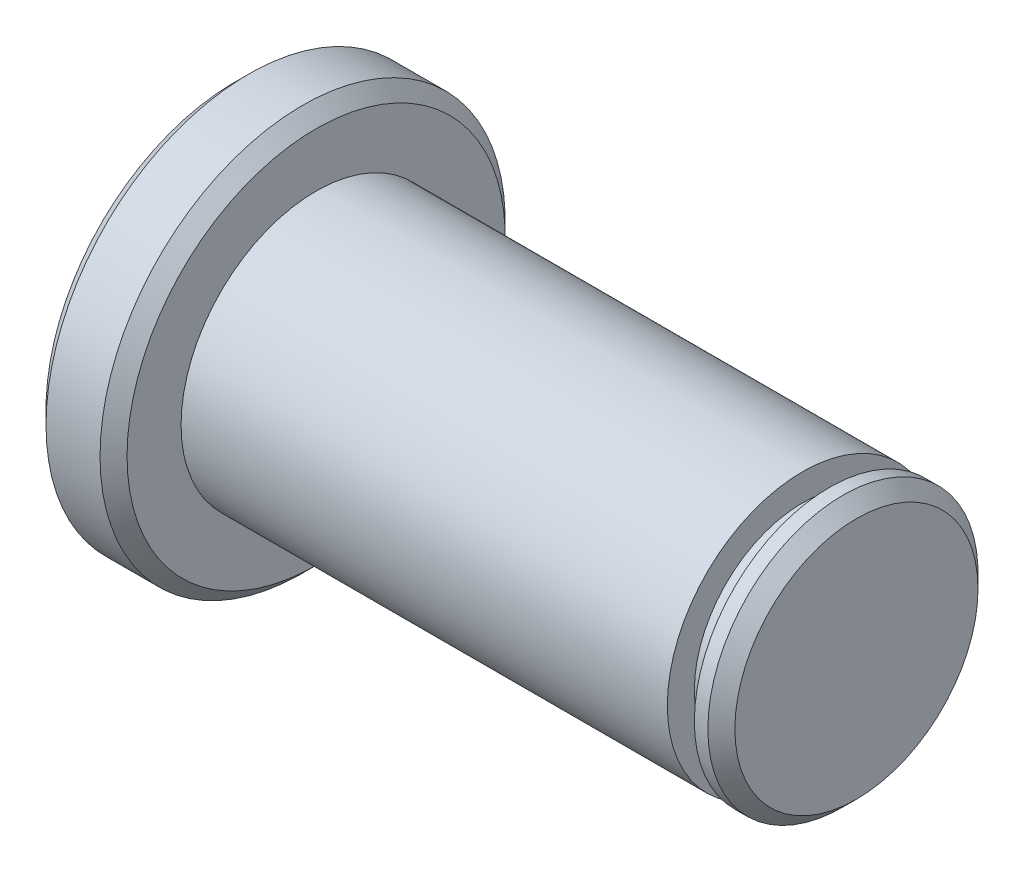
ISO-10303-21;
HEADER;
FILE_DESCRIPTION(('STEP AP214'),'2;1');
FILE_NAME('part.step','',(''),(''),'','','');
FILE_SCHEMA(('AUTOMOTIVE_DESIGN { 1 0 10303 214 1 1 1 1 }'));
ENDSEC;
DATA;
#1=APPLICATION_CONTEXT('core data for automotive mechanical design processes');
#2=APPLICATION_PROTOCOL_DEFINITION('international standard','automotive_design',2000,#1);
#3=PRODUCT_CONTEXT('',#1,'mechanical');
#4=PRODUCT('Part','Part','',(#3));
#5=PRODUCT_RELATED_PRODUCT_CATEGORY('part','',(#4));
#6=PRODUCT_DEFINITION_FORMATION('','',#4);
#7=PRODUCT_DEFINITION_CONTEXT('part definition',#1,'design');
#8=PRODUCT_DEFINITION('design','',#6,#7);
#9=PRODUCT_DEFINITION_SHAPE('','',#8);
#10=(LENGTH_UNIT() NAMED_UNIT(*) SI_UNIT(.MILLI.,.METRE.));
#11=(NAMED_UNIT(*) PLANE_ANGLE_UNIT() SI_UNIT($,.RADIAN.));
#12=(NAMED_UNIT(*) SI_UNIT($,.STERADIAN.) SOLID_ANGLE_UNIT());
#13=UNCERTAINTY_MEASURE_WITH_UNIT(LENGTH_MEASURE(1.E-05),#10,'distance_accuracy_value','');
#14=(GEOMETRIC_REPRESENTATION_CONTEXT(3) GLOBAL_UNCERTAINTY_ASSIGNED_CONTEXT((#13)) GLOBAL_UNIT_ASSIGNED_CONTEXT((#10,
#11,#12)) REPRESENTATION_CONTEXT('',''));
#15=CARTESIAN_POINT('',(0.,0.,0.));
#16=DIRECTION('',(0.,0.,1.));
#17=DIRECTION('',(1.,0.,0.));
#18=AXIS2_PLACEMENT_3D('',#15,#16,#17);
#19=CARTESIAN_POINT('',(-6.23188405797101,0.,0.));
#20=DIRECTION('',(1.,0.,0.));
#21=DIRECTION('',(0.,0.,-1.));
#22=AXIS2_PLACEMENT_3D('',#19,#20,#21);
#23=PLANE('',#22);
#24=CARTESIAN_POINT('',(-6.23188405797101,0.,0.));
#25=DIRECTION('',(1.,0.,0.));
#26=DIRECTION('',(0.,0.,-1.));
#27=AXIS2_PLACEMENT_3D('',#24,#25,#26);
#28=CIRCLE('',#27,7.);
#29=CARTESIAN_POINT('',(-6.23188405797101,0.,-7.));
#30=VERTEX_POINT('',#29);
#31=EDGE_CURVE('E10',#30,#30,#28,.F.);
#32=ORIENTED_EDGE('',*,*,#31,.T.);
#33=EDGE_LOOP('',(#32));
#34=FACE_BOUND('',#33,.T.);
#35=ADVANCED_FACE('F39',(#34),#23,.F.);
#36=CARTESIAN_POINT('',(-11.6304347826087,0.,0.));
#37=DIRECTION('',(-1.,0.,0.));
#38=DIRECTION('',(0.,0.,1.));
#39=AXIS2_PLACEMENT_3D('',#36,#37,#38);
#40=CYLINDRICAL_SURFACE('',#39,7.5);
#41=CARTESIAN_POINT('',(-3.73188405797101,0.,0.));
#42=DIRECTION('',(-1.,0.,0.));
#43=DIRECTION('',(0.,0.,1.));
#44=AXIS2_PLACEMENT_3D('',#41,#42,#43);
#45=CIRCLE('',#44,7.5);
#46=CARTESIAN_POINT('',(-3.73188405797101,0.,7.5));
#47=VERTEX_POINT('',#46);
#48=EDGE_CURVE('E53',#47,#47,#45,.T.);
#49=ORIENTED_EDGE('',*,*,#48,.T.);
#50=EDGE_LOOP('',(#49));
#51=FACE_BOUND('',#50,.T.);
#52=CARTESIAN_POINT('',(-5.73188405797101,0.,0.));
#53=DIRECTION('',(1.,0.,0.));
#54=DIRECTION('',(0.,0.,-1.));
#55=AXIS2_PLACEMENT_3D('',#52,#53,#54);
#56=CIRCLE('',#55,7.5);
#57=CARTESIAN_POINT('',(-5.73188405797101,0.,-7.5));
#58=VERTEX_POINT('',#57);
#59=EDGE_CURVE('E58',#58,#58,#56,.T.);
#60=ORIENTED_EDGE('',*,*,#59,.T.);
#61=EDGE_LOOP('',(#60));
#62=FACE_BOUND('',#61,.T.);
#63=ADVANCED_FACE('F111',(#51,#62),#40,.T.);
#64=CARTESIAN_POINT('',(-3.23188405797101,7.5,0.));
#65=DIRECTION('',(-1.,0.,0.));
#66=DIRECTION('',(0.,0.,1.));
#67=AXIS2_PLACEMENT_3D('',#64,#65,#66);
#68=PLANE('',#67);
#69=CARTESIAN_POINT('',(-3.23188405797101,0.,0.));
#70=DIRECTION('',(-1.,0.,0.));
#71=DIRECTION('',(0.,0.,1.));
#72=AXIS2_PLACEMENT_3D('',#69,#70,#71);
#73=CIRCLE('',#72,7.);
#74=CARTESIAN_POINT('',(-3.23188405797101,0.,7.));
#75=VERTEX_POINT('',#74);
#76=EDGE_CURVE('E48',#75,#75,#73,.F.);
#77=ORIENTED_EDGE('',*,*,#76,.T.);
#78=EDGE_LOOP('',(#77));
#79=FACE_BOUND('',#78,.T.);
#80=CARTESIAN_POINT('',(-3.23188405797101,0.,0.));
#81=DIRECTION('',(-1.,0.,0.));
#82=DIRECTION('',(0.,0.,1.));
#83=AXIS2_PLACEMENT_3D('',#80,#81,#82);
#84=CIRCLE('',#83,5.);
#85=CARTESIAN_POINT('',(-3.23188405797101,0.,5.));
#86=VERTEX_POINT('',#85);
#87=EDGE_CURVE('E72',#86,#86,#84,.T.);
#88=ORIENTED_EDGE('',*,*,#87,.T.);
#89=EDGE_LOOP('',(#88));
#90=FACE_BOUND('',#89,.T.);
#91=ADVANCED_FACE('F116',(#79,#90),#68,.F.);
#92=CARTESIAN_POINT('',(-11.6304347826087,0.,0.));
#93=DIRECTION('',(-1.,0.,0.));
#94=DIRECTION('',(0.,0.,1.));
#95=AXIS2_PLACEMENT_3D('',#92,#93,#94);
#96=CYLINDRICAL_SURFACE('',#95,5.);
#97=ORIENTED_EDGE('',*,*,#87,.F.);
#98=EDGE_LOOP('',(#97));
#99=FACE_BOUND('',#98,.T.);
#100=CARTESIAN_POINT('',(14.768115942029,0.,0.));
#101=DIRECTION('',(-1.,0.,0.));
#102=DIRECTION('',(0.,0.,1.));
#103=AXIS2_PLACEMENT_3D('',#100,#101,#102);
#104=CIRCLE('',#103,5.);
#105=CARTESIAN_POINT('',(14.768115942029,0.,5.));
#106=VERTEX_POINT('',#105);
#107=EDGE_CURVE('E76',#106,#106,#104,.T.);
#108=ORIENTED_EDGE('',*,*,#107,.T.);
#109=EDGE_LOOP('',(#108));
#110=FACE_BOUND('',#109,.T.);
#111=ADVANCED_FACE('F173',(#99,#110),#96,.T.);
#112=CARTESIAN_POINT('',(14.768115942029,5.,0.));
#113=DIRECTION('',(-1.,0.,0.));
#114=DIRECTION('',(0.,0.,1.));
#115=AXIS2_PLACEMENT_3D('',#112,#113,#114);
#116=PLANE('',#115);
#117=ORIENTED_EDGE('',*,*,#107,.F.);
#118=EDGE_LOOP('',(#117));
#119=FACE_BOUND('',#118,.T.);
#120=CARTESIAN_POINT('',(14.768115942029,0.,0.));
#121=DIRECTION('',(-1.,0.,0.));
#122=DIRECTION('',(0.,0.,1.));
#123=AXIS2_PLACEMENT_3D('',#120,#121,#122);
#124=CIRCLE('',#123,4.);
#125=CARTESIAN_POINT('',(14.768115942029,0.,4.));
#126=VERTEX_POINT('',#125);
#127=EDGE_CURVE('E80',#126,#126,#124,.T.);
#128=ORIENTED_EDGE('',*,*,#127,.T.);
#129=EDGE_LOOP('',(#128));
#130=FACE_BOUND('',#129,.T.);
#131=ADVANCED_FACE('F198',(#119,#130),#116,.F.);
#132=CARTESIAN_POINT('',(-11.6304347826087,0.,0.));
#133=DIRECTION('',(-1.,0.,0.));
#134=DIRECTION('',(0.,0.,1.));
#135=AXIS2_PLACEMENT_3D('',#132,#133,#134);
#136=CYLINDRICAL_SURFACE('',#135,4.);
#137=ORIENTED_EDGE('',*,*,#127,.F.);
#138=EDGE_LOOP('',(#137));
#139=FACE_BOUND('',#138,.T.);
#140=CARTESIAN_POINT('',(15.768115942029,0.,0.));
#141=DIRECTION('',(-1.,0.,0.));
#142=DIRECTION('',(0.,0.,1.));
#143=AXIS2_PLACEMENT_3D('',#140,#141,#142);
#144=CIRCLE('',#143,4.);
#145=CARTESIAN_POINT('',(15.768115942029,0.,4.));
#146=VERTEX_POINT('',#145);
#147=EDGE_CURVE('E84',#146,#146,#144,.T.);
#148=ORIENTED_EDGE('',*,*,#147,.T.);
#149=EDGE_LOOP('',(#148));
#150=FACE_BOUND('',#149,.T.);
#151=ADVANCED_FACE('F107',(#139,#150),#136,.T.);
#152=CARTESIAN_POINT('',(15.768115942029,4.,0.));
#153=DIRECTION('',(1.,0.,0.));
#154=DIRECTION('',(0.,0.,-1.));
#155=AXIS2_PLACEMENT_3D('',#152,#153,#154);
#156=PLANE('',#155);
#157=ORIENTED_EDGE('',*,*,#147,.F.);
#158=EDGE_LOOP('',(#157));
#159=FACE_BOUND('',#158,.T.);
#160=CARTESIAN_POINT('',(15.768115942029,0.,0.));
#161=DIRECTION('',(-1.,0.,0.));
#162=DIRECTION('',(0.,0.,1.));
#163=AXIS2_PLACEMENT_3D('',#160,#161,#162);
#164=CIRCLE('',#163,5.);
#165=CARTESIAN_POINT('',(15.768115942029,0.,5.));
#166=VERTEX_POINT('',#165);
#167=EDGE_CURVE('E88',#166,#166,#164,.T.);
#168=ORIENTED_EDGE('',*,*,#167,.T.);
#169=EDGE_LOOP('',(#168));
#170=FACE_BOUND('',#169,.T.);
#171=ADVANCED_FACE('F93',(#159,#170),#156,.F.);
#172=CARTESIAN_POINT('',(-11.6304347826087,0.,0.));
#173=DIRECTION('',(-1.,0.,0.));
#174=DIRECTION('',(0.,0.,1.));
#175=AXIS2_PLACEMENT_3D('',#172,#173,#174);
#176=CYLINDRICAL_SURFACE('',#175,5.);
#177=CARTESIAN_POINT('',(16.268115942029,0.,0.));
#178=DIRECTION('',(-1.,0.,0.));
#179=DIRECTION('',(0.,0.,1.));
#180=AXIS2_PLACEMENT_3D('',#177,#178,#179);
#181=CIRCLE('',#180,5.);
#182=CARTESIAN_POINT('',(16.268115942029,0.,5.));
#183=VERTEX_POINT('',#182);
#184=EDGE_CURVE('E68',#183,#183,#181,.T.);
#185=ORIENTED_EDGE('',*,*,#184,.T.);
#186=EDGE_LOOP('',(#185));
#187=FACE_BOUND('',#186,.T.);
#188=ORIENTED_EDGE('',*,*,#167,.F.);
#189=EDGE_LOOP('',(#188));
#190=FACE_BOUND('',#189,.T.);
#191=ADVANCED_FACE('F95',(#187,#190),#176,.T.);
#192=CARTESIAN_POINT('',(16.768115942029,5.,0.));
#193=DIRECTION('',(-1.,0.,0.));
#194=DIRECTION('',(0.,0.,1.));
#195=AXIS2_PLACEMENT_3D('',#192,#193,#194);
#196=PLANE('',#195);
#197=CARTESIAN_POINT('',(16.768115942029,0.,0.));
#198=DIRECTION('',(-1.,0.,0.));
#199=DIRECTION('',(0.,0.,1.));
#200=AXIS2_PLACEMENT_3D('',#197,#198,#199);
#201=CIRCLE('',#200,4.5);
#202=CARTESIAN_POINT('',(16.768115942029,0.,4.5));
#203=VERTEX_POINT('',#202);
#204=EDGE_CURVE('E64',#203,#203,#201,.F.);
#205=ORIENTED_EDGE('',*,*,#204,.T.);
#206=EDGE_LOOP('',(#205));
#207=FACE_BOUND('',#206,.T.);
#208=ADVANCED_FACE('F97',(#207),#196,.F.);
#209=CARTESIAN_POINT('',(16.268115942029,0.,0.));
#210=DIRECTION('',(-1.,0.,0.));
#211=DIRECTION('',(0.,0.,1.));
#212=AXIS2_PLACEMENT_3D('',#209,#210,#211);
#213=CONICAL_SURFACE('',#212,5.,0.785398163397458);
#214=ORIENTED_EDGE('',*,*,#204,.F.);
#215=EDGE_LOOP('',(#214));
#216=FACE_BOUND('',#215,.T.);
#217=ORIENTED_EDGE('',*,*,#184,.F.);
#218=EDGE_LOOP('',(#217));
#219=FACE_BOUND('',#218,.T.);
#220=ADVANCED_FACE('F104',(#216,#219),#213,.T.);
#221=CARTESIAN_POINT('',(-3.73188405797101,0.,0.));
#222=DIRECTION('',(-1.,0.,0.));
#223=DIRECTION('',(0.,0.,1.));
#224=AXIS2_PLACEMENT_3D('',#221,#222,#223);
#225=CONICAL_SURFACE('',#224,7.5,0.785398163397449);
#226=ORIENTED_EDGE('',*,*,#76,.F.);
#227=EDGE_LOOP('',(#226));
#228=FACE_BOUND('',#227,.T.);
#229=ORIENTED_EDGE('',*,*,#48,.F.);
#230=EDGE_LOOP('',(#229));
#231=FACE_BOUND('',#230,.T.);
#232=ADVANCED_FACE('F126',(#228,#231),#225,.T.);
#233=CARTESIAN_POINT('',(-6.23188405797101,0.,0.));
#234=DIRECTION('',(1.,0.,0.));
#235=DIRECTION('',(0.,0.,-1.));
#236=AXIS2_PLACEMENT_3D('',#233,#234,#235);
#237=CONICAL_SURFACE('',#236,7.,0.785398163397444);
#238=ORIENTED_EDGE('',*,*,#59,.F.);
#239=EDGE_LOOP('',(#238));
#240=FACE_BOUND('',#239,.T.);
#241=ORIENTED_EDGE('',*,*,#31,.F.);
#242=EDGE_LOOP('',(#241));
#243=FACE_BOUND('',#242,.T.);
#244=ADVANCED_FACE('F42',(#240,#243),#237,.T.);
#245=CLOSED_SHELL('',(#35,#63,#91,#111,#131,#151,#171,#191,#208,#220,#232,#244));
#246=MANIFOLD_SOLID_BREP('B2',#245);
#247=ADVANCED_BREP_SHAPE_REPRESENTATION('',(#18,#246),#14);
#248=SHAPE_DEFINITION_REPRESENTATION(#9,#247);
ENDSEC;
END-ISO-10303-21;
